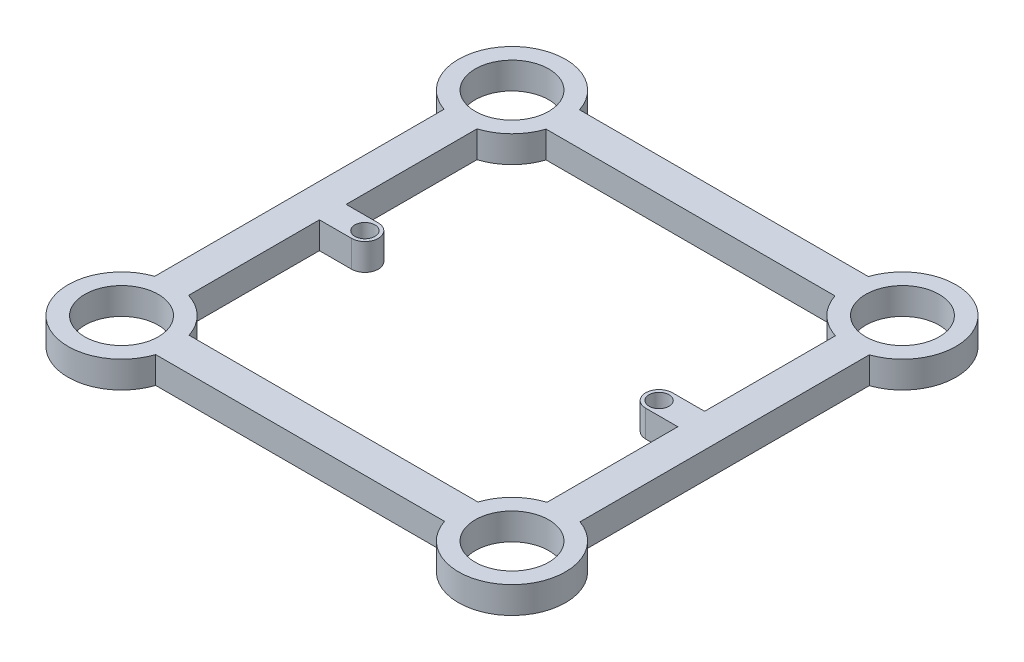
ISO-10303-21;
HEADER;
FILE_DESCRIPTION(('STEP AP214'),'2;1');
FILE_NAME('part.step','',(''),(''),'','','');
FILE_SCHEMA(('AUTOMOTIVE_DESIGN { 1 0 10303 214 1 1 1 1 }'));
ENDSEC;
DATA;
#1=APPLICATION_CONTEXT('core data for automotive mechanical design processes');
#2=APPLICATION_PROTOCOL_DEFINITION('international standard','automotive_design',2000,#1);
#3=PRODUCT_CONTEXT('',#1,'mechanical');
#4=PRODUCT('Part','Part','',(#3));
#5=PRODUCT_RELATED_PRODUCT_CATEGORY('part','',(#4));
#6=PRODUCT_DEFINITION_FORMATION('','',#4);
#7=PRODUCT_DEFINITION_CONTEXT('part definition',#1,'design');
#8=PRODUCT_DEFINITION('design','',#6,#7);
#9=PRODUCT_DEFINITION_SHAPE('','',#8);
#10=(LENGTH_UNIT() NAMED_UNIT(*) SI_UNIT(.MILLI.,.METRE.));
#11=(NAMED_UNIT(*) PLANE_ANGLE_UNIT() SI_UNIT($,.RADIAN.));
#12=(NAMED_UNIT(*) SI_UNIT($,.STERADIAN.) SOLID_ANGLE_UNIT());
#13=UNCERTAINTY_MEASURE_WITH_UNIT(LENGTH_MEASURE(1.E-05),#10,'distance_accuracy_value','');
#14=(GEOMETRIC_REPRESENTATION_CONTEXT(3) GLOBAL_UNCERTAINTY_ASSIGNED_CONTEXT((#13)) GLOBAL_UNIT_ASSIGNED_CONTEXT((#10,
#11,#12)) REPRESENTATION_CONTEXT('',''));
#15=CARTESIAN_POINT('',(0.,0.,0.));
#16=DIRECTION('',(0.,0.,1.));
#17=DIRECTION('',(1.,0.,0.));
#18=AXIS2_PLACEMENT_3D('',#15,#16,#17);
#19=CARTESIAN_POINT('',(0.,2.54,-1.26999999999998));
#20=DIRECTION('',(0.,0.,-1.));
#21=DIRECTION('',(-1.,0.,0.));
#22=AXIS2_PLACEMENT_3D('',#19,#20,#21);
#23=PLANE('',#22);
#24=DIRECTION('',(1.,0.,0.));
#25=VECTOR('',#24,1.);
#26=CARTESIAN_POINT('',(0.,0.,-1.26999999999998));
#27=LINE('',#26,#25);
#28=CARTESIAN_POINT('',(13.9696917741455,0.,-1.27));
#29=VERTEX_POINT('',#28);
#30=CARTESIAN_POINT('',(17.0202573011455,0.,-1.27));
#31=VERTEX_POINT('',#30);
#32=EDGE_CURVE('E319',#29,#31,#27,.T.);
#33=ORIENTED_EDGE('',*,*,#32,.F.);
#34=DIRECTION('',(0.,-1.,0.));
#35=VECTOR('',#34,1.);
#36=CARTESIAN_POINT('',(13.9696917741455,2.54,-1.27));
#37=LINE('',#36,#35);
#38=CARTESIAN_POINT('',(13.9696917741455,2.54,-1.27));
#39=VERTEX_POINT('',#38);
#40=EDGE_CURVE('E11',#39,#29,#37,.T.);
#41=ORIENTED_EDGE('',*,*,#40,.F.);
#42=DIRECTION('',(1.,0.,0.));
#43=VECTOR('',#42,1.);
#44=CARTESIAN_POINT('',(0.,2.54,-1.26999999999998));
#45=LINE('',#44,#43);
#46=CARTESIAN_POINT('',(17.0202573011455,2.54,-1.27));
#47=VERTEX_POINT('',#46);
#48=EDGE_CURVE('E394',#39,#47,#45,.T.);
#49=ORIENTED_EDGE('',*,*,#48,.T.);
#50=DIRECTION('',(0.,-1.,0.));
#51=VECTOR('',#50,1.);
#52=CARTESIAN_POINT('',(17.0202573011455,2.54,-1.27));
#53=LINE('',#52,#51);
#54=EDGE_CURVE('E136',#47,#31,#53,.T.);
#55=ORIENTED_EDGE('',*,*,#54,.T.);
#56=EDGE_LOOP('',(#33,#41,#49,#55));
#57=FACE_BOUND('',#56,.T.);
#58=ADVANCED_FACE('F35',(#57),#23,.T.);
#59=CARTESIAN_POINT('',(13.9696917741455,2.54,0.));
#60=DIRECTION('',(0.,-1.,0.));
#61=DIRECTION('',(0.,0.,-1.));
#62=AXIS2_PLACEMENT_3D('',#59,#60,#61);
#63=CYLINDRICAL_SURFACE('',#62,1.27);
#64=CARTESIAN_POINT('',(13.9696917741455,0.,0.));
#65=DIRECTION('',(0.,1.,0.));
#66=DIRECTION('',(0.,0.,1.));
#67=AXIS2_PLACEMENT_3D('',#64,#65,#66);
#68=CIRCLE('',#67,1.27);
#69=CARTESIAN_POINT('',(13.9696917741455,0.,1.27));
#70=VERTEX_POINT('',#69);
#71=EDGE_CURVE('E316',#29,#70,#68,.T.);
#72=ORIENTED_EDGE('',*,*,#71,.T.);
#73=DIRECTION('',(0.,-1.,0.));
#74=VECTOR('',#73,1.);
#75=CARTESIAN_POINT('',(13.9696917741455,2.54,1.27));
#76=LINE('',#75,#74);
#77=CARTESIAN_POINT('',(13.9696917741455,2.54,1.27));
#78=VERTEX_POINT('',#77);
#79=EDGE_CURVE('E45',#78,#70,#76,.T.);
#80=ORIENTED_EDGE('',*,*,#79,.F.);
#81=CARTESIAN_POINT('',(13.9696917741455,2.54,0.));
#82=DIRECTION('',(0.,1.,0.));
#83=DIRECTION('',(0.,0.,1.));
#84=AXIS2_PLACEMENT_3D('',#81,#82,#83);
#85=CIRCLE('',#84,1.27);
#86=EDGE_CURVE('E391',#39,#78,#85,.T.);
#87=ORIENTED_EDGE('',*,*,#86,.F.);
#88=ORIENTED_EDGE('',*,*,#40,.T.);
#89=EDGE_LOOP('',(#72,#80,#87,#88));
#90=FACE_BOUND('',#89,.T.);
#91=ADVANCED_FACE('F467',(#90),#63,.T.);
#92=CARTESIAN_POINT('',(0.,2.54,1.27));
#93=DIRECTION('',(0.,0.,-1.));
#94=DIRECTION('',(-1.,0.,0.));
#95=AXIS2_PLACEMENT_3D('',#92,#93,#94);
#96=PLANE('',#95);
#97=DIRECTION('',(1.,0.,0.));
#98=VECTOR('',#97,1.);
#99=CARTESIAN_POINT('',(0.,0.,1.27));
#100=LINE('',#99,#98);
#101=CARTESIAN_POINT('',(17.0202573011455,0.,1.27));
#102=VERTEX_POINT('',#101);
#103=EDGE_CURVE('E313',#70,#102,#100,.T.);
#104=ORIENTED_EDGE('',*,*,#103,.T.);
#105=DIRECTION('',(0.,-1.,0.));
#106=VECTOR('',#105,1.);
#107=CARTESIAN_POINT('',(17.0202573011455,2.54,1.27));
#108=LINE('',#107,#106);
#109=CARTESIAN_POINT('',(17.0202573011455,2.54,1.27));
#110=VERTEX_POINT('',#109);
#111=EDGE_CURVE('E253',#110,#102,#108,.T.);
#112=ORIENTED_EDGE('',*,*,#111,.F.);
#113=DIRECTION('',(1.,0.,0.));
#114=VECTOR('',#113,1.);
#115=CARTESIAN_POINT('',(0.,2.54,1.27));
#116=LINE('',#115,#114);
#117=EDGE_CURVE('E389',#78,#110,#116,.T.);
#118=ORIENTED_EDGE('',*,*,#117,.F.);
#119=ORIENTED_EDGE('',*,*,#79,.T.);
#120=EDGE_LOOP('',(#104,#112,#118,#119));
#121=FACE_BOUND('',#120,.T.);
#122=ADVANCED_FACE('F472',(#121),#96,.F.);
#123=CARTESIAN_POINT('',(17.0202573011455,2.54,0.));
#124=DIRECTION('',(-1.,0.,0.));
#125=DIRECTION('',(0.,0.,1.));
#126=AXIS2_PLACEMENT_3D('',#123,#124,#125);
#127=PLANE('',#126);
#128=DIRECTION('',(0.,0.,-1.));
#129=VECTOR('',#128,1.);
#130=CARTESIAN_POINT('',(17.0202573011455,0.,0.));
#131=LINE('',#130,#129);
#132=CARTESIAN_POINT('',(17.0202573011455,0.,13.6952795460762));
#133=VERTEX_POINT('',#132);
#134=EDGE_CURVE('E310',#133,#102,#131,.T.);
#135=ORIENTED_EDGE('',*,*,#134,.F.);
#136=DIRECTION('',(0.,-1.,0.));
#137=VECTOR('',#136,1.);
#138=CARTESIAN_POINT('',(17.0202573011455,2.54,13.6952795460762));
#139=LINE('',#138,#137);
#140=CARTESIAN_POINT('',(17.0202573011455,2.54,13.6952795460762));
#141=VERTEX_POINT('',#140);
#142=EDGE_CURVE('E251',#141,#133,#139,.T.);
#143=ORIENTED_EDGE('',*,*,#142,.F.);
#144=DIRECTION('',(0.,0.,-1.));
#145=VECTOR('',#144,1.);
#146=CARTESIAN_POINT('',(17.0202573011455,2.54,0.));
#147=LINE('',#146,#145);
#148=EDGE_CURVE('E386',#141,#110,#147,.T.);
#149=ORIENTED_EDGE('',*,*,#148,.T.);
#150=ORIENTED_EDGE('',*,*,#111,.T.);
#151=EDGE_LOOP('',(#135,#143,#149,#150));
#152=FACE_BOUND('',#151,.T.);
#153=ADVANCED_FACE('F475',(#152),#127,.T.);
#154=CARTESIAN_POINT('',(18.542,2.54,18.542));
#155=DIRECTION('',(0.,-1.,0.));
#156=DIRECTION('',(0.,0.,-1.));
#157=AXIS2_PLACEMENT_3D('',#154,#155,#156);
#158=CYLINDRICAL_SURFACE('',#157,5.08);
#159=CARTESIAN_POINT('',(18.542,0.,18.542));
#160=DIRECTION('',(0.,1.,0.));
#161=DIRECTION('',(0.,0.,1.));
#162=AXIS2_PLACEMENT_3D('',#159,#160,#161);
#163=CIRCLE('',#162,5.08);
#164=CARTESIAN_POINT('',(13.7164177812413,0.,16.9545));
#165=VERTEX_POINT('',#164);
#166=EDGE_CURVE('E307',#165,#133,#163,.F.);
#167=ORIENTED_EDGE('',*,*,#166,.F.);
#168=DIRECTION('',(0.,-1.,0.));
#169=VECTOR('',#168,1.);
#170=CARTESIAN_POINT('',(13.7164177812413,2.54,16.9545));
#171=LINE('',#170,#169);
#172=CARTESIAN_POINT('',(13.7164177812413,2.54,16.9545));
#173=VERTEX_POINT('',#172);
#174=EDGE_CURVE('E249',#173,#165,#171,.T.);
#175=ORIENTED_EDGE('',*,*,#174,.F.);
#176=CARTESIAN_POINT('',(18.542,2.54,18.542));
#177=DIRECTION('',(0.,1.,0.));
#178=DIRECTION('',(0.,0.,1.));
#179=AXIS2_PLACEMENT_3D('',#176,#177,#178);
#180=CIRCLE('',#179,5.08);
#181=EDGE_CURVE('E383',#173,#141,#180,.F.);
#182=ORIENTED_EDGE('',*,*,#181,.T.);
#183=ORIENTED_EDGE('',*,*,#142,.T.);
#184=EDGE_LOOP('',(#167,#175,#182,#183));
#185=FACE_BOUND('',#184,.T.);
#186=ADVANCED_FACE('F478',(#185),#158,.T.);
#187=CARTESIAN_POINT('',(0.,2.54,16.9545));
#188=DIRECTION('',(0.,0.,-1.));
#189=DIRECTION('',(-1.,0.,0.));
#190=AXIS2_PLACEMENT_3D('',#187,#188,#189);
#191=PLANE('',#190);
#192=DIRECTION('',(1.,0.,0.));
#193=VECTOR('',#192,1.);
#194=CARTESIAN_POINT('',(0.,0.,16.9545));
#195=LINE('',#194,#193);
#196=CARTESIAN_POINT('',(-13.7164177812413,0.,16.9545));
#197=VERTEX_POINT('',#196);
#198=EDGE_CURVE('E304',#197,#165,#195,.T.);
#199=ORIENTED_EDGE('',*,*,#198,.F.);
#200=DIRECTION('',(0.,-1.,0.));
#201=VECTOR('',#200,1.);
#202=CARTESIAN_POINT('',(-13.7164177812413,2.54,16.9545));
#203=LINE('',#202,#201);
#204=CARTESIAN_POINT('',(-13.7164177812413,2.54,16.9545));
#205=VERTEX_POINT('',#204);
#206=EDGE_CURVE('E247',#205,#197,#203,.T.);
#207=ORIENTED_EDGE('',*,*,#206,.F.);
#208=DIRECTION('',(1.,0.,0.));
#209=VECTOR('',#208,1.);
#210=CARTESIAN_POINT('',(0.,2.54,16.9545));
#211=LINE('',#210,#209);
#212=EDGE_CURVE('E380',#205,#173,#211,.T.);
#213=ORIENTED_EDGE('',*,*,#212,.T.);
#214=ORIENTED_EDGE('',*,*,#174,.T.);
#215=EDGE_LOOP('',(#199,#207,#213,#214));
#216=FACE_BOUND('',#215,.T.);
#217=ADVANCED_FACE('F483',(#216),#191,.T.);
#218=CARTESIAN_POINT('',(-18.542,2.54,18.542));
#219=DIRECTION('',(0.,-1.,0.));
#220=DIRECTION('',(0.,0.,-1.));
#221=AXIS2_PLACEMENT_3D('',#218,#219,#220);
#222=CYLINDRICAL_SURFACE('',#221,5.08);
#223=CARTESIAN_POINT('',(-18.542,0.,18.542));
#224=DIRECTION('',(0.,1.,0.));
#225=DIRECTION('',(0.,0.,1.));
#226=AXIS2_PLACEMENT_3D('',#223,#224,#225);
#227=CIRCLE('',#226,5.08);
#228=CARTESIAN_POINT('',(-17.0202573011455,0.,13.6952795460762));
#229=VERTEX_POINT('',#228);
#230=EDGE_CURVE('E301',#229,#197,#227,.F.);
#231=ORIENTED_EDGE('',*,*,#230,.F.);
#232=DIRECTION('',(0.,-1.,0.));
#233=VECTOR('',#232,1.);
#234=CARTESIAN_POINT('',(-17.0202573011455,2.54,13.6952795460762));
#235=LINE('',#234,#233);
#236=CARTESIAN_POINT('',(-17.0202573011455,2.54,13.6952795460762));
#237=VERTEX_POINT('',#236);
#238=EDGE_CURVE('E245',#237,#229,#235,.T.);
#239=ORIENTED_EDGE('',*,*,#238,.F.);
#240=CARTESIAN_POINT('',(-18.542,2.54,18.542));
#241=DIRECTION('',(0.,1.,0.));
#242=DIRECTION('',(0.,0.,1.));
#243=AXIS2_PLACEMENT_3D('',#240,#241,#242);
#244=CIRCLE('',#243,5.08);
#245=EDGE_CURVE('E377',#237,#205,#244,.F.);
#246=ORIENTED_EDGE('',*,*,#245,.T.);
#247=ORIENTED_EDGE('',*,*,#206,.T.);
#248=EDGE_LOOP('',(#231,#239,#246,#247));
#249=FACE_BOUND('',#248,.T.);
#250=ADVANCED_FACE('F486',(#249),#222,.T.);
#251=CARTESIAN_POINT('',(-17.0202573011455,2.54,0.));
#252=DIRECTION('',(-1.,0.,0.));
#253=DIRECTION('',(0.,0.,1.));
#254=AXIS2_PLACEMENT_3D('',#251,#252,#253);
#255=PLANE('',#254);
#256=DIRECTION('',(0.,0.,-1.));
#257=VECTOR('',#256,1.);
#258=CARTESIAN_POINT('',(-17.0202573011455,0.,0.));
#259=LINE('',#258,#257);
#260=CARTESIAN_POINT('',(-17.0202573011455,0.,1.27));
#261=VERTEX_POINT('',#260);
#262=EDGE_CURVE('E298',#229,#261,#259,.T.);
#263=ORIENTED_EDGE('',*,*,#262,.T.);
#264=DIRECTION('',(0.,-1.,0.));
#265=VECTOR('',#264,1.);
#266=CARTESIAN_POINT('',(-17.0202573011455,2.54,1.27));
#267=LINE('',#266,#265);
#268=CARTESIAN_POINT('',(-17.0202573011455,2.54,1.27));
#269=VERTEX_POINT('',#268);
#270=EDGE_CURVE('E243',#269,#261,#267,.T.);
#271=ORIENTED_EDGE('',*,*,#270,.F.);
#272=DIRECTION('',(0.,0.,-1.));
#273=VECTOR('',#272,1.);
#274=CARTESIAN_POINT('',(-17.0202573011455,2.54,0.));
#275=LINE('',#274,#273);
#276=EDGE_CURVE('E375',#237,#269,#275,.T.);
#277=ORIENTED_EDGE('',*,*,#276,.F.);
#278=ORIENTED_EDGE('',*,*,#238,.T.);
#279=EDGE_LOOP('',(#263,#271,#277,#278));
#280=FACE_BOUND('',#279,.T.);
#281=ADVANCED_FACE('F491',(#280),#255,.F.);
#282=CARTESIAN_POINT('',(0.,2.54,1.27));
#283=DIRECTION('',(0.,0.,1.));
#284=DIRECTION('',(1.,0.,0.));
#285=AXIS2_PLACEMENT_3D('',#282,#283,#284);
#286=PLANE('',#285);
#287=DIRECTION('',(-1.,0.,0.));
#288=VECTOR('',#287,1.);
#289=CARTESIAN_POINT('',(0.,0.,1.27));
#290=LINE('',#289,#288);
#291=CARTESIAN_POINT('',(-13.9696917741455,0.,1.27));
#292=VERTEX_POINT('',#291);
#293=EDGE_CURVE('E295',#292,#261,#290,.T.);
#294=ORIENTED_EDGE('',*,*,#293,.F.);
#295=DIRECTION('',(0.,-1.,0.));
#296=VECTOR('',#295,1.);
#297=CARTESIAN_POINT('',(-13.9696917741455,2.54,1.27));
#298=LINE('',#297,#296);
#299=CARTESIAN_POINT('',(-13.9696917741455,2.54,1.27));
#300=VERTEX_POINT('',#299);
#301=EDGE_CURVE('E241',#300,#292,#298,.T.);
#302=ORIENTED_EDGE('',*,*,#301,.F.);
#303=DIRECTION('',(-1.,0.,0.));
#304=VECTOR('',#303,1.);
#305=CARTESIAN_POINT('',(0.,2.54,1.27));
#306=LINE('',#305,#304);
#307=EDGE_CURVE('E372',#300,#269,#306,.T.);
#308=ORIENTED_EDGE('',*,*,#307,.T.);
#309=ORIENTED_EDGE('',*,*,#270,.T.);
#310=EDGE_LOOP('',(#294,#302,#308,#309));
#311=FACE_BOUND('',#310,.T.);
#312=ADVANCED_FACE('F495',(#311),#286,.T.);
#313=CARTESIAN_POINT('',(-13.9696917741455,2.54,0.));
#314=DIRECTION('',(0.,-1.,0.));
#315=DIRECTION('',(0.,0.,-1.));
#316=AXIS2_PLACEMENT_3D('',#313,#314,#315);
#317=CYLINDRICAL_SURFACE('',#316,1.27);
#318=CARTESIAN_POINT('',(-13.9696917741455,0.,0.));
#319=DIRECTION('',(0.,1.,0.));
#320=DIRECTION('',(0.,0.,1.));
#321=AXIS2_PLACEMENT_3D('',#318,#319,#320);
#322=CIRCLE('',#321,1.27);
#323=CARTESIAN_POINT('',(-13.9696917741455,0.,-1.26999999999999));
#324=VERTEX_POINT('',#323);
#325=EDGE_CURVE('E292',#292,#324,#322,.T.);
#326=ORIENTED_EDGE('',*,*,#325,.T.);
#327=DIRECTION('',(0.,-1.,0.));
#328=VECTOR('',#327,1.);
#329=CARTESIAN_POINT('',(-13.9696917741455,2.54,-1.26999999999999));
#330=LINE('',#329,#328);
#331=CARTESIAN_POINT('',(-13.9696917741455,2.54,-1.26999999999999));
#332=VERTEX_POINT('',#331);
#333=EDGE_CURVE('E238',#332,#324,#330,.T.);
#334=ORIENTED_EDGE('',*,*,#333,.F.);
#335=CARTESIAN_POINT('',(-13.9696917741455,2.54,0.));
#336=DIRECTION('',(0.,1.,0.));
#337=DIRECTION('',(0.,0.,1.));
#338=AXIS2_PLACEMENT_3D('',#335,#336,#337);
#339=CIRCLE('',#338,1.27);
#340=EDGE_CURVE('E369',#300,#332,#339,.T.);
#341=ORIENTED_EDGE('',*,*,#340,.F.);
#342=ORIENTED_EDGE('',*,*,#301,.T.);
#343=EDGE_LOOP('',(#326,#334,#341,#342));
#344=FACE_BOUND('',#343,.T.);
#345=ADVANCED_FACE('F500',(#344),#317,.T.);
#346=CARTESIAN_POINT('',(0.,2.54,-1.26999999999997));
#347=DIRECTION('',(0.,0.,1.));
#348=DIRECTION('',(1.,0.,0.));
#349=AXIS2_PLACEMENT_3D('',#346,#347,#348);
#350=PLANE('',#349);
#351=DIRECTION('',(-1.,0.,0.));
#352=VECTOR('',#351,1.);
#353=CARTESIAN_POINT('',(0.,0.,-1.26999999999997));
#354=LINE('',#353,#352);
#355=CARTESIAN_POINT('',(-17.0202573011455,0.,-1.27));
#356=VERTEX_POINT('',#355);
#357=EDGE_CURVE('E289',#324,#356,#354,.T.);
#358=ORIENTED_EDGE('',*,*,#357,.T.);
#359=DIRECTION('',(0.,-1.,0.));
#360=VECTOR('',#359,1.);
#361=CARTESIAN_POINT('',(-17.0202573011455,2.54,-1.27));
#362=LINE('',#361,#360);
#363=CARTESIAN_POINT('',(-17.0202573011455,2.54,-1.27));
#364=VERTEX_POINT('',#363);
#365=EDGE_CURVE('E236',#364,#356,#362,.T.);
#366=ORIENTED_EDGE('',*,*,#365,.F.);
#367=DIRECTION('',(-1.,0.,0.));
#368=VECTOR('',#367,1.);
#369=CARTESIAN_POINT('',(0.,2.54,-1.26999999999997));
#370=LINE('',#369,#368);
#371=EDGE_CURVE('E367',#332,#364,#370,.T.);
#372=ORIENTED_EDGE('',*,*,#371,.F.);
#373=ORIENTED_EDGE('',*,*,#333,.T.);
#374=EDGE_LOOP('',(#358,#366,#372,#373));
#375=FACE_BOUND('',#374,.T.);
#376=ADVANCED_FACE('F503',(#375),#350,.F.);
#377=CARTESIAN_POINT('',(-17.0202573011455,2.54,0.));
#378=DIRECTION('',(1.,0.,0.));
#379=DIRECTION('',(0.,0.,-1.));
#380=AXIS2_PLACEMENT_3D('',#377,#378,#379);
#381=PLANE('',#380);
#382=DIRECTION('',(0.,0.,1.));
#383=VECTOR('',#382,1.);
#384=CARTESIAN_POINT('',(-17.0202573011455,0.,0.));
#385=LINE('',#384,#383);
#386=CARTESIAN_POINT('',(-17.0202573011455,0.,-13.6952795460762));
#387=VERTEX_POINT('',#386);
#388=EDGE_CURVE('E286',#387,#356,#385,.T.);
#389=ORIENTED_EDGE('',*,*,#388,.F.);
#390=DIRECTION('',(0.,-1.,0.));
#391=VECTOR('',#390,1.);
#392=CARTESIAN_POINT('',(-17.0202573011455,2.54,-13.6952795460762));
#393=LINE('',#392,#391);
#394=CARTESIAN_POINT('',(-17.0202573011455,2.54,-13.6952795460762));
#395=VERTEX_POINT('',#394);
#396=EDGE_CURVE('E230',#395,#387,#393,.T.);
#397=ORIENTED_EDGE('',*,*,#396,.F.);
#398=DIRECTION('',(0.,0.,1.));
#399=VECTOR('',#398,1.);
#400=CARTESIAN_POINT('',(-17.0202573011455,2.54,0.));
#401=LINE('',#400,#399);
#402=EDGE_CURVE('E364',#395,#364,#401,.T.);
#403=ORIENTED_EDGE('',*,*,#402,.T.);
#404=ORIENTED_EDGE('',*,*,#365,.T.);
#405=EDGE_LOOP('',(#389,#397,#403,#404));
#406=FACE_BOUND('',#405,.T.);
#407=ADVANCED_FACE('F506',(#406),#381,.T.);
#408=CARTESIAN_POINT('',(-18.542,2.54,-18.542));
#409=DIRECTION('',(0.,-1.,0.));
#410=DIRECTION('',(0.,0.,-1.));
#411=AXIS2_PLACEMENT_3D('',#408,#409,#410);
#412=CYLINDRICAL_SURFACE('',#411,5.08);
#413=CARTESIAN_POINT('',(-18.542,0.,-18.542));
#414=DIRECTION('',(0.,1.,0.));
#415=DIRECTION('',(0.,0.,1.));
#416=AXIS2_PLACEMENT_3D('',#413,#414,#415);
#417=CIRCLE('',#416,5.08);
#418=CARTESIAN_POINT('',(-13.7164177812413,0.,-16.9545));
#419=VERTEX_POINT('',#418);
#420=EDGE_CURVE('E283',#387,#419,#417,.T.);
#421=ORIENTED_EDGE('',*,*,#420,.T.);
#422=DIRECTION('',(0.,-1.,0.));
#423=VECTOR('',#422,1.);
#424=CARTESIAN_POINT('',(-13.7164177812413,2.54,-16.9545));
#425=LINE('',#424,#423);
#426=CARTESIAN_POINT('',(-13.7164177812413,2.54,-16.9545));
#427=VERTEX_POINT('',#426);
#428=EDGE_CURVE('E228',#427,#419,#425,.T.);
#429=ORIENTED_EDGE('',*,*,#428,.F.);
#430=CARTESIAN_POINT('',(-18.542,2.54,-18.542));
#431=DIRECTION('',(0.,1.,0.));
#432=DIRECTION('',(0.,0.,1.));
#433=AXIS2_PLACEMENT_3D('',#430,#431,#432);
#434=CIRCLE('',#433,5.08);
#435=EDGE_CURVE('E221',#395,#427,#434,.T.);
#436=ORIENTED_EDGE('',*,*,#435,.F.);
#437=ORIENTED_EDGE('',*,*,#396,.T.);
#438=EDGE_LOOP('',(#421,#429,#436,#437));
#439=FACE_BOUND('',#438,.T.);
#440=ADVANCED_FACE('F509',(#439),#412,.T.);
#441=CARTESIAN_POINT('',(0.,2.54,-16.9545));
#442=DIRECTION('',(0.,0.,-1.));
#443=DIRECTION('',(-1.,0.,0.));
#444=AXIS2_PLACEMENT_3D('',#441,#442,#443);
#445=PLANE('',#444);
#446=DIRECTION('',(1.,0.,0.));
#447=VECTOR('',#446,1.);
#448=CARTESIAN_POINT('',(0.,0.,-16.9545));
#449=LINE('',#448,#447);
#450=CARTESIAN_POINT('',(13.7164177812413,0.,-16.9545));
#451=VERTEX_POINT('',#450);
#452=EDGE_CURVE('E227',#419,#451,#449,.T.);
#453=ORIENTED_EDGE('',*,*,#452,.T.);
#454=DIRECTION('',(0.,-1.,0.));
#455=VECTOR('',#454,1.);
#456=CARTESIAN_POINT('',(13.7164177812413,2.54,-16.9545));
#457=LINE('',#456,#455);
#458=CARTESIAN_POINT('',(13.7164177812413,2.54,-16.9545));
#459=VERTEX_POINT('',#458);
#460=EDGE_CURVE('E212',#459,#451,#457,.T.);
#461=ORIENTED_EDGE('',*,*,#460,.F.);
#462=DIRECTION('',(1.,0.,0.));
#463=VECTOR('',#462,1.);
#464=CARTESIAN_POINT('',(0.,2.54,-16.9545));
#465=LINE('',#464,#463);
#466=EDGE_CURVE('E215',#427,#459,#465,.T.);
#467=ORIENTED_EDGE('',*,*,#466,.F.);
#468=ORIENTED_EDGE('',*,*,#428,.T.);
#469=EDGE_LOOP('',(#453,#461,#467,#468));
#470=FACE_BOUND('',#469,.T.);
#471=ADVANCED_FACE('F226',(#470),#445,.F.);
#472=CARTESIAN_POINT('',(18.542,2.54,-18.542));
#473=DIRECTION('',(0.,-1.,0.));
#474=DIRECTION('',(0.,0.,-1.));
#475=AXIS2_PLACEMENT_3D('',#472,#473,#474);
#476=CYLINDRICAL_SURFACE('',#475,5.08);
#477=CARTESIAN_POINT('',(18.542,0.,-18.542));
#478=DIRECTION('',(0.,1.,0.));
#479=DIRECTION('',(0.,0.,1.));
#480=AXIS2_PLACEMENT_3D('',#477,#478,#479);
#481=CIRCLE('',#480,5.08);
#482=CARTESIAN_POINT('',(17.0202573011455,0.,-13.6952795460762));
#483=VERTEX_POINT('',#482);
#484=EDGE_CURVE('E280',#451,#483,#481,.T.);
#485=ORIENTED_EDGE('',*,*,#484,.T.);
#486=DIRECTION('',(0.,-1.,0.));
#487=VECTOR('',#486,1.);
#488=CARTESIAN_POINT('',(17.0202573011455,2.54,-13.6952795460762));
#489=LINE('',#488,#487);
#490=CARTESIAN_POINT('',(17.0202573011455,2.54,-13.6952795460762));
#491=VERTEX_POINT('',#490);
#492=EDGE_CURVE('E214',#491,#483,#489,.T.);
#493=ORIENTED_EDGE('',*,*,#492,.F.);
#494=CARTESIAN_POINT('',(18.542,2.54,-18.542));
#495=DIRECTION('',(0.,1.,0.));
#496=DIRECTION('',(0.,0.,1.));
#497=AXIS2_PLACEMENT_3D('',#494,#495,#496);
#498=CIRCLE('',#497,5.08);
#499=EDGE_CURVE('E207',#459,#491,#498,.T.);
#500=ORIENTED_EDGE('',*,*,#499,.F.);
#501=ORIENTED_EDGE('',*,*,#460,.T.);
#502=EDGE_LOOP('',(#485,#493,#500,#501));
#503=FACE_BOUND('',#502,.T.);
#504=ADVANCED_FACE('F210',(#503),#476,.T.);
#505=CARTESIAN_POINT('',(18.542,2.54,18.542));
#506=DIRECTION('',(0.,-1.,0.));
#507=DIRECTION('',(0.,0.,-1.));
#508=AXIS2_PLACEMENT_3D('',#505,#506,#507);
#509=CYLINDRICAL_SURFACE('',#508,5.08);
#510=CARTESIAN_POINT('',(18.542,0.,18.542));
#511=DIRECTION('',(0.,1.,0.));
#512=DIRECTION('',(0.,0.,1.));
#513=AXIS2_PLACEMENT_3D('',#510,#511,#512);
#514=CIRCLE('',#513,5.08);
#515=CARTESIAN_POINT('',(20.1952573011455,0.,13.7385491262833));
#516=VERTEX_POINT('',#515);
#517=CARTESIAN_POINT('',(13.7164177812413,0.,20.1295));
#518=VERTEX_POINT('',#517);
#519=EDGE_CURVE('E353',#516,#518,#514,.F.);
#520=ORIENTED_EDGE('',*,*,#519,.F.);
#521=DIRECTION('',(0.,-1.,0.));
#522=VECTOR('',#521,1.);
#523=CARTESIAN_POINT('',(20.1952573011455,2.54,13.7385491262833));
#524=LINE('',#523,#522);
#525=CARTESIAN_POINT('',(20.1952573011455,2.54,13.7385491262833));
#526=VERTEX_POINT('',#525);
#527=EDGE_CURVE('E39',#526,#516,#524,.T.);
#528=ORIENTED_EDGE('',*,*,#527,.F.);
#529=CARTESIAN_POINT('',(18.542,2.54,18.542));
#530=DIRECTION('',(0.,1.,0.));
#531=DIRECTION('',(0.,0.,1.));
#532=AXIS2_PLACEMENT_3D('',#529,#530,#531);
#533=CIRCLE('',#532,5.08);
#534=CARTESIAN_POINT('',(13.7164177812413,2.54,20.1295));
#535=VERTEX_POINT('',#534);
#536=EDGE_CURVE('E425',#526,#535,#533,.F.);
#537=ORIENTED_EDGE('',*,*,#536,.T.);
#538=DIRECTION('',(0.,-1.,0.));
#539=VECTOR('',#538,1.);
#540=CARTESIAN_POINT('',(13.7164177812413,2.54,20.1295));
#541=LINE('',#540,#539);
#542=EDGE_CURVE('E257',#535,#518,#541,.T.);
#543=ORIENTED_EDGE('',*,*,#542,.T.);
#544=EDGE_LOOP('',(#520,#528,#537,#543));
#545=FACE_BOUND('',#544,.T.);
#546=ADVANCED_FACE('F563',(#545),#509,.T.);
#547=CARTESIAN_POINT('',(20.1952573011455,2.54,0.));
#548=DIRECTION('',(1.,0.,0.));
#549=DIRECTION('',(0.,0.,-1.));
#550=AXIS2_PLACEMENT_3D('',#547,#548,#549);
#551=PLANE('',#550);
#552=DIRECTION('',(0.,0.,1.));
#553=VECTOR('',#552,1.);
#554=CARTESIAN_POINT('',(20.1952573011455,0.,0.));
#555=LINE('',#554,#553);
#556=CARTESIAN_POINT('',(20.1952573011455,0.,-13.7385491262833));
#557=VERTEX_POINT('',#556);
#558=EDGE_CURVE('E350',#557,#516,#555,.T.);
#559=ORIENTED_EDGE('',*,*,#558,.F.);
#560=DIRECTION('',(0.,-1.,0.));
#561=VECTOR('',#560,1.);
#562=CARTESIAN_POINT('',(20.1952573011455,2.54,-13.7385491262833));
#563=LINE('',#562,#561);
#564=CARTESIAN_POINT('',(20.1952573011455,2.54,-13.7385491262833));
#565=VERTEX_POINT('',#564);
#566=EDGE_CURVE('E269',#565,#557,#563,.T.);
#567=ORIENTED_EDGE('',*,*,#566,.F.);
#568=DIRECTION('',(0.,0.,1.));
#569=VECTOR('',#568,1.);
#570=CARTESIAN_POINT('',(20.1952573011455,2.54,0.));
#571=LINE('',#570,#569);
#572=EDGE_CURVE('E423',#565,#526,#571,.T.);
#573=ORIENTED_EDGE('',*,*,#572,.T.);
#574=ORIENTED_EDGE('',*,*,#527,.T.);
#575=EDGE_LOOP('',(#559,#567,#573,#574));
#576=FACE_BOUND('',#575,.T.);
#577=ADVANCED_FACE('F560',(#576),#551,.T.);
#578=CARTESIAN_POINT('',(18.542,2.54,-18.542));
#579=DIRECTION('',(0.,-1.,0.));
#580=DIRECTION('',(0.,0.,-1.));
#581=AXIS2_PLACEMENT_3D('',#578,#579,#580);
#582=CYLINDRICAL_SURFACE('',#581,5.08);
#583=CARTESIAN_POINT('',(18.542,0.,-18.542));
#584=DIRECTION('',(0.,1.,0.));
#585=DIRECTION('',(0.,0.,1.));
#586=AXIS2_PLACEMENT_3D('',#583,#584,#585);
#587=CIRCLE('',#586,5.08);
#588=CARTESIAN_POINT('',(13.7164177812413,0.,-20.1295));
#589=VERTEX_POINT('',#588);
#590=EDGE_CURVE('E348',#557,#589,#587,.T.);
#591=ORIENTED_EDGE('',*,*,#590,.T.);
#592=DIRECTION('',(0.,-1.,0.));
#593=VECTOR('',#592,1.);
#594=CARTESIAN_POINT('',(13.7164177812413,2.54,-20.1295));
#595=LINE('',#594,#593);
#596=CARTESIAN_POINT('',(13.7164177812413,2.54,-20.1295));
#597=VERTEX_POINT('',#596);
#598=EDGE_CURVE('E268',#597,#589,#595,.T.);
#599=ORIENTED_EDGE('',*,*,#598,.F.);
#600=CARTESIAN_POINT('',(18.542,2.54,-18.542));
#601=DIRECTION('',(0.,1.,0.));
#602=DIRECTION('',(0.,0.,1.));
#603=AXIS2_PLACEMENT_3D('',#600,#601,#602);
#604=CIRCLE('',#603,5.08);
#605=EDGE_CURVE('E421',#565,#597,#604,.T.);
#606=ORIENTED_EDGE('',*,*,#605,.F.);
#607=ORIENTED_EDGE('',*,*,#566,.T.);
#608=EDGE_LOOP('',(#591,#599,#606,#607));
#609=FACE_BOUND('',#608,.T.);
#610=ADVANCED_FACE('F556',(#609),#582,.T.);
#611=CARTESIAN_POINT('',(0.,2.54,-20.1295));
#612=DIRECTION('',(0.,0.,-1.));
#613=DIRECTION('',(-1.,0.,0.));
#614=AXIS2_PLACEMENT_3D('',#611,#612,#613);
#615=PLANE('',#614);
#616=DIRECTION('',(1.,0.,0.));
#617=VECTOR('',#616,1.);
#618=CARTESIAN_POINT('',(0.,0.,-20.1295));
#619=LINE('',#618,#617);
#620=CARTESIAN_POINT('',(-13.7164177812413,0.,-20.1295));
#621=VERTEX_POINT('',#620);
#622=EDGE_CURVE('E345',#621,#589,#619,.T.);
#623=ORIENTED_EDGE('',*,*,#622,.F.);
#624=DIRECTION('',(0.,-1.,0.));
#625=VECTOR('',#624,1.);
#626=CARTESIAN_POINT('',(-13.7164177812413,2.54,-20.1295));
#627=LINE('',#626,#625);
#628=CARTESIAN_POINT('',(-13.7164177812413,2.54,-20.1295));
#629=VERTEX_POINT('',#628);
#630=EDGE_CURVE('E266',#629,#621,#627,.T.);
#631=ORIENTED_EDGE('',*,*,#630,.F.);
#632=DIRECTION('',(1.,0.,0.));
#633=VECTOR('',#632,1.);
#634=CARTESIAN_POINT('',(0.,2.54,-20.1295));
#635=LINE('',#634,#633);
#636=EDGE_CURVE('E418',#629,#597,#635,.T.);
#637=ORIENTED_EDGE('',*,*,#636,.T.);
#638=ORIENTED_EDGE('',*,*,#598,.T.);
#639=EDGE_LOOP('',(#623,#631,#637,#638));
#640=FACE_BOUND('',#639,.T.);
#641=ADVANCED_FACE('F552',(#640),#615,.T.);
#642=CARTESIAN_POINT('',(-18.542,2.54,-18.542));
#643=DIRECTION('',(0.,-1.,0.));
#644=DIRECTION('',(0.,0.,-1.));
#645=AXIS2_PLACEMENT_3D('',#642,#643,#644);
#646=CYLINDRICAL_SURFACE('',#645,5.08);
#647=CARTESIAN_POINT('',(-18.542,0.,-18.542));
#648=DIRECTION('',(0.,1.,0.));
#649=DIRECTION('',(0.,0.,1.));
#650=AXIS2_PLACEMENT_3D('',#647,#648,#649);
#651=CIRCLE('',#650,5.08);
#652=CARTESIAN_POINT('',(-20.1952573011455,0.,-13.7385491262833));
#653=VERTEX_POINT('',#652);
#654=EDGE_CURVE('E342',#621,#653,#651,.T.);
#655=ORIENTED_EDGE('',*,*,#654,.T.);
#656=DIRECTION('',(0.,-1.,0.));
#657=VECTOR('',#656,1.);
#658=CARTESIAN_POINT('',(-20.1952573011455,2.54,-13.7385491262833));
#659=LINE('',#658,#657);
#660=CARTESIAN_POINT('',(-20.1952573011455,2.54,-13.7385491262833));
#661=VERTEX_POINT('',#660);
#662=EDGE_CURVE('E263',#661,#653,#659,.T.);
#663=ORIENTED_EDGE('',*,*,#662,.F.);
#664=CARTESIAN_POINT('',(-18.542,2.54,-18.542));
#665=DIRECTION('',(0.,1.,0.));
#666=DIRECTION('',(0.,0.,1.));
#667=AXIS2_PLACEMENT_3D('',#664,#665,#666);
#668=CIRCLE('',#667,5.08);
#669=EDGE_CURVE('E415',#629,#661,#668,.T.);
#670=ORIENTED_EDGE('',*,*,#669,.F.);
#671=ORIENTED_EDGE('',*,*,#630,.T.);
#672=EDGE_LOOP('',(#655,#663,#670,#671));
#673=FACE_BOUND('',#672,.T.);
#674=ADVANCED_FACE('F548',(#673),#646,.T.);
#675=CARTESIAN_POINT('',(-20.1952573011455,2.54,0.));
#676=DIRECTION('',(1.,0.,0.));
#677=DIRECTION('',(0.,0.,-1.));
#678=AXIS2_PLACEMENT_3D('',#675,#676,#677);
#679=PLANE('',#678);
#680=DIRECTION('',(0.,0.,1.));
#681=VECTOR('',#680,1.);
#682=CARTESIAN_POINT('',(-20.1952573011455,0.,0.));
#683=LINE('',#682,#681);
#684=CARTESIAN_POINT('',(-20.1952573011455,0.,13.7385491262833));
#685=VERTEX_POINT('',#684);
#686=EDGE_CURVE('E339',#653,#685,#683,.T.);
#687=ORIENTED_EDGE('',*,*,#686,.T.);
#688=DIRECTION('',(0.,-1.,0.));
#689=VECTOR('',#688,1.);
#690=CARTESIAN_POINT('',(-20.1952573011455,2.54,13.7385491262833));
#691=LINE('',#690,#689);
#692=CARTESIAN_POINT('',(-20.1952573011455,2.54,13.7385491262833));
#693=VERTEX_POINT('',#692);
#694=EDGE_CURVE('E261',#693,#685,#691,.T.);
#695=ORIENTED_EDGE('',*,*,#694,.F.);
#696=DIRECTION('',(0.,0.,1.));
#697=VECTOR('',#696,1.);
#698=CARTESIAN_POINT('',(-20.1952573011455,2.54,0.));
#699=LINE('',#698,#697);
#700=EDGE_CURVE('E413',#661,#693,#699,.T.);
#701=ORIENTED_EDGE('',*,*,#700,.F.);
#702=ORIENTED_EDGE('',*,*,#662,.T.);
#703=EDGE_LOOP('',(#687,#695,#701,#702));
#704=FACE_BOUND('',#703,.T.);
#705=ADVANCED_FACE('F544',(#704),#679,.F.);
#706=CARTESIAN_POINT('',(-18.542,2.54,18.542));
#707=DIRECTION('',(0.,-1.,0.));
#708=DIRECTION('',(0.,0.,-1.));
#709=AXIS2_PLACEMENT_3D('',#706,#707,#708);
#710=CYLINDRICAL_SURFACE('',#709,5.08);
#711=CARTESIAN_POINT('',(-18.542,0.,18.542));
#712=DIRECTION('',(0.,1.,0.));
#713=DIRECTION('',(0.,0.,1.));
#714=AXIS2_PLACEMENT_3D('',#711,#712,#713);
#715=CIRCLE('',#714,5.08);
#716=CARTESIAN_POINT('',(-13.7164177812413,0.,20.1295));
#717=VERTEX_POINT('',#716);
#718=EDGE_CURVE('E336',#717,#685,#715,.F.);
#719=ORIENTED_EDGE('',*,*,#718,.F.);
#720=DIRECTION('',(0.,-1.,0.));
#721=VECTOR('',#720,1.);
#722=CARTESIAN_POINT('',(-13.7164177812413,2.54,20.1295));
#723=LINE('',#722,#721);
#724=CARTESIAN_POINT('',(-13.7164177812413,2.54,20.1295));
#725=VERTEX_POINT('',#724);
#726=EDGE_CURVE('E259',#725,#717,#723,.T.);
#727=ORIENTED_EDGE('',*,*,#726,.F.);
#728=CARTESIAN_POINT('',(-18.542,2.54,18.542));
#729=DIRECTION('',(0.,1.,0.));
#730=DIRECTION('',(0.,0.,1.));
#731=AXIS2_PLACEMENT_3D('',#728,#729,#730);
#732=CIRCLE('',#731,5.08);
#733=EDGE_CURVE('E410',#725,#693,#732,.F.);
#734=ORIENTED_EDGE('',*,*,#733,.T.);
#735=ORIENTED_EDGE('',*,*,#694,.T.);
#736=EDGE_LOOP('',(#719,#727,#734,#735));
#737=FACE_BOUND('',#736,.T.);
#738=ADVANCED_FACE('F456',(#737),#710,.T.);
#739=CARTESIAN_POINT('',(-18.542,2.54,18.542));
#740=DIRECTION('',(0.,-1.,0.));
#741=DIRECTION('',(0.,0.,-1.));
#742=AXIS2_PLACEMENT_3D('',#739,#740,#741);
#743=CYLINDRICAL_SURFACE('',#742,3.4925);
#744=CARTESIAN_POINT('',(-18.542,2.54,18.542));
#745=DIRECTION('',(0.,1.,0.));
#746=DIRECTION('',(0.,0.,1.));
#747=AXIS2_PLACEMENT_3D('',#744,#745,#746);
#748=CIRCLE('',#747,3.4925);
#749=CARTESIAN_POINT('',(-18.542,2.54,22.0345));
#750=VERTEX_POINT('',#749);
#751=EDGE_CURVE('E396',#750,#750,#748,.F.);
#752=ORIENTED_EDGE('',*,*,#751,.F.);
#753=EDGE_LOOP('',(#752));
#754=FACE_BOUND('',#753,.T.);
#755=CARTESIAN_POINT('',(-18.542,0.,18.542));
#756=DIRECTION('',(0.,1.,0.));
#757=DIRECTION('',(0.,0.,1.));
#758=AXIS2_PLACEMENT_3D('',#755,#756,#757);
#759=CIRCLE('',#758,3.4925);
#760=CARTESIAN_POINT('',(-18.542,0.,22.0345));
#761=VERTEX_POINT('',#760);
#762=EDGE_CURVE('E321',#761,#761,#759,.F.);
#763=ORIENTED_EDGE('',*,*,#762,.T.);
#764=EDGE_LOOP('',(#763));
#765=FACE_BOUND('',#764,.T.);
#766=ADVANCED_FACE('F452',(#754,#765),#743,.F.);
#767=CARTESIAN_POINT('',(18.542,2.54,18.542));
#768=DIRECTION('',(0.,-1.,0.));
#769=DIRECTION('',(0.,0.,-1.));
#770=AXIS2_PLACEMENT_3D('',#767,#768,#769);
#771=CYLINDRICAL_SURFACE('',#770,3.4925);
#772=CARTESIAN_POINT('',(18.542,2.54,18.542));
#773=DIRECTION('',(0.,1.,0.));
#774=DIRECTION('',(0.,0.,1.));
#775=AXIS2_PLACEMENT_3D('',#772,#773,#774);
#776=CIRCLE('',#775,3.4925);
#777=CARTESIAN_POINT('',(18.542,2.54,22.0345));
#778=VERTEX_POINT('',#777);
#779=EDGE_CURVE('E399',#778,#778,#776,.F.);
#780=ORIENTED_EDGE('',*,*,#779,.F.);
#781=EDGE_LOOP('',(#780));
#782=FACE_BOUND('',#781,.T.);
#783=CARTESIAN_POINT('',(18.542,0.,18.542));
#784=DIRECTION('',(0.,1.,0.));
#785=DIRECTION('',(0.,0.,1.));
#786=AXIS2_PLACEMENT_3D('',#783,#784,#785);
#787=CIRCLE('',#786,3.4925);
#788=CARTESIAN_POINT('',(18.542,0.,22.0345));
#789=VERTEX_POINT('',#788);
#790=EDGE_CURVE('E324',#789,#789,#787,.F.);
#791=ORIENTED_EDGE('',*,*,#790,.T.);
#792=EDGE_LOOP('',(#791));
#793=FACE_BOUND('',#792,.T.);
#794=ADVANCED_FACE('F455',(#782,#793),#771,.F.);
#795=CARTESIAN_POINT('',(-18.542,2.54,-18.542));
#796=DIRECTION('',(0.,-1.,0.));
#797=DIRECTION('',(0.,0.,-1.));
#798=AXIS2_PLACEMENT_3D('',#795,#796,#797);
#799=CYLINDRICAL_SURFACE('',#798,3.4925);
#800=CARTESIAN_POINT('',(-18.542,2.54,-18.542));
#801=DIRECTION('',(0.,1.,0.));
#802=DIRECTION('',(0.,0.,1.));
#803=AXIS2_PLACEMENT_3D('',#800,#801,#802);
#804=CIRCLE('',#803,3.4925);
#805=CARTESIAN_POINT('',(-18.542,2.54,-15.0495));
#806=VERTEX_POINT('',#805);
#807=EDGE_CURVE('E402',#806,#806,#804,.T.);
#808=ORIENTED_EDGE('',*,*,#807,.T.);
#809=EDGE_LOOP('',(#808));
#810=FACE_BOUND('',#809,.T.);
#811=CARTESIAN_POINT('',(-18.542,0.,-18.542));
#812=DIRECTION('',(0.,1.,0.));
#813=DIRECTION('',(0.,0.,1.));
#814=AXIS2_PLACEMENT_3D('',#811,#812,#813);
#815=CIRCLE('',#814,3.4925);
#816=CARTESIAN_POINT('',(-18.542,0.,-15.0495));
#817=VERTEX_POINT('',#816);
#818=EDGE_CURVE('E327',#817,#817,#815,.T.);
#819=ORIENTED_EDGE('',*,*,#818,.F.);
#820=EDGE_LOOP('',(#819));
#821=FACE_BOUND('',#820,.T.);
#822=ADVANCED_FACE('F528',(#810,#821),#799,.F.);
#823=CARTESIAN_POINT('',(18.542,2.54,-18.542));
#824=DIRECTION('',(0.,-1.,0.));
#825=DIRECTION('',(0.,0.,-1.));
#826=AXIS2_PLACEMENT_3D('',#823,#824,#825);
#827=CYLINDRICAL_SURFACE('',#826,3.4925);
#828=CARTESIAN_POINT('',(18.542,2.54,-18.542));
#829=DIRECTION('',(0.,1.,0.));
#830=DIRECTION('',(0.,0.,1.));
#831=AXIS2_PLACEMENT_3D('',#828,#829,#830);
#832=CIRCLE('',#831,3.4925);
#833=CARTESIAN_POINT('',(18.542,2.54,-15.0495));
#834=VERTEX_POINT('',#833);
#835=EDGE_CURVE('E405',#834,#834,#832,.T.);
#836=ORIENTED_EDGE('',*,*,#835,.T.);
#837=EDGE_LOOP('',(#836));
#838=FACE_BOUND('',#837,.T.);
#839=CARTESIAN_POINT('',(18.542,0.,-18.542));
#840=DIRECTION('',(0.,1.,0.));
#841=DIRECTION('',(0.,0.,1.));
#842=AXIS2_PLACEMENT_3D('',#839,#840,#841);
#843=CIRCLE('',#842,3.4925);
#844=CARTESIAN_POINT('',(18.542,0.,-15.0495));
#845=VERTEX_POINT('',#844);
#846=EDGE_CURVE('E330',#845,#845,#843,.T.);
#847=ORIENTED_EDGE('',*,*,#846,.F.);
#848=EDGE_LOOP('',(#847));
#849=FACE_BOUND('',#848,.T.);
#850=ADVANCED_FACE('F532',(#838,#849),#827,.F.);
#851=CARTESIAN_POINT('',(0.,2.54,20.1295));
#852=DIRECTION('',(0.,0.,-1.));
#853=DIRECTION('',(-1.,0.,0.));
#854=AXIS2_PLACEMENT_3D('',#851,#852,#853);
#855=PLANE('',#854);
#856=DIRECTION('',(1.,0.,0.));
#857=VECTOR('',#856,1.);
#858=CARTESIAN_POINT('',(0.,0.,20.1295));
#859=LINE('',#858,#857);
#860=EDGE_CURVE('E333',#717,#518,#859,.T.);
#861=ORIENTED_EDGE('',*,*,#860,.T.);
#862=ORIENTED_EDGE('',*,*,#542,.F.);
#863=DIRECTION('',(1.,0.,0.));
#864=VECTOR('',#863,1.);
#865=CARTESIAN_POINT('',(0.,2.54,20.1295));
#866=LINE('',#865,#864);
#867=EDGE_CURVE('E408',#725,#535,#866,.T.);
#868=ORIENTED_EDGE('',*,*,#867,.F.);
#869=ORIENTED_EDGE('',*,*,#726,.T.);
#870=EDGE_LOOP('',(#861,#862,#868,#869));
#871=FACE_BOUND('',#870,.T.);
#872=ADVANCED_FACE('F536',(#871),#855,.F.);
#873=CARTESIAN_POINT('',(-13.9696917741455,2.54,0.));
#874=DIRECTION('',(0.,-1.,0.));
#875=DIRECTION('',(0.,0.,-1.));
#876=AXIS2_PLACEMENT_3D('',#873,#874,#875);
#877=CYLINDRICAL_SURFACE('',#876,0.9525);
#878=CARTESIAN_POINT('',(-13.9696917741455,2.54,0.));
#879=DIRECTION('',(0.,1.,0.));
#880=DIRECTION('',(0.,0.,1.));
#881=AXIS2_PLACEMENT_3D('',#878,#879,#880);
#882=CIRCLE('',#881,0.9525);
#883=CARTESIAN_POINT('',(-13.9696917741455,2.54,0.952500000000002));
#884=VERTEX_POINT('',#883);
#885=EDGE_CURVE('E427',#884,#884,#882,.T.);
#886=ORIENTED_EDGE('',*,*,#885,.T.);
#887=EDGE_LOOP('',(#886));
#888=FACE_BOUND('',#887,.T.);
#889=CARTESIAN_POINT('',(-13.9696917741455,0.,0.));
#890=DIRECTION('',(0.,1.,0.));
#891=DIRECTION('',(0.,0.,1.));
#892=AXIS2_PLACEMENT_3D('',#889,#890,#891);
#893=CIRCLE('',#892,0.9525);
#894=CARTESIAN_POINT('',(-13.9696917741455,0.,0.952500000000002));
#895=VERTEX_POINT('',#894);
#896=EDGE_CURVE('E356',#895,#895,#893,.T.);
#897=ORIENTED_EDGE('',*,*,#896,.F.);
#898=EDGE_LOOP('',(#897));
#899=FACE_BOUND('',#898,.T.);
#900=ADVANCED_FACE('F540',(#888,#899),#877,.F.);
#901=CARTESIAN_POINT('',(13.9696917741455,2.54,0.));
#902=DIRECTION('',(0.,-1.,0.));
#903=DIRECTION('',(0.,0.,-1.));
#904=AXIS2_PLACEMENT_3D('',#901,#902,#903);
#905=CYLINDRICAL_SURFACE('',#904,0.9525);
#906=CARTESIAN_POINT('',(13.9696917741455,2.54,0.));
#907=DIRECTION('',(0.,1.,0.));
#908=DIRECTION('',(0.,0.,1.));
#909=AXIS2_PLACEMENT_3D('',#906,#907,#908);
#910=CIRCLE('',#909,0.9525);
#911=CARTESIAN_POINT('',(13.9696917741455,2.54,0.952500000000002));
#912=VERTEX_POINT('',#911);
#913=EDGE_CURVE('E279',#912,#912,#910,.T.);
#914=ORIENTED_EDGE('',*,*,#913,.T.);
#915=EDGE_LOOP('',(#914));
#916=FACE_BOUND('',#915,.T.);
#917=CARTESIAN_POINT('',(13.9696917741455,0.,0.));
#918=DIRECTION('',(0.,1.,0.));
#919=DIRECTION('',(0.,0.,1.));
#920=AXIS2_PLACEMENT_3D('',#917,#918,#919);
#921=CIRCLE('',#920,0.9525);
#922=CARTESIAN_POINT('',(13.9696917741455,0.,0.952500000000002));
#923=VERTEX_POINT('',#922);
#924=EDGE_CURVE('E359',#923,#923,#921,.T.);
#925=ORIENTED_EDGE('',*,*,#924,.F.);
#926=EDGE_LOOP('',(#925));
#927=FACE_BOUND('',#926,.T.);
#928=ADVANCED_FACE('F37',(#916,#927),#905,.F.);
#929=CARTESIAN_POINT('',(17.0202573011455,2.54,0.));
#930=DIRECTION('',(1.,0.,0.));
#931=DIRECTION('',(0.,0.,-1.));
#932=AXIS2_PLACEMENT_3D('',#929,#930,#931);
#933=PLANE('',#932);
#934=DIRECTION('',(0.,0.,1.));
#935=VECTOR('',#934,1.);
#936=CARTESIAN_POINT('',(17.0202573011455,0.,0.));
#937=LINE('',#936,#935);
#938=EDGE_CURVE('E129',#483,#31,#937,.T.);
#939=ORIENTED_EDGE('',*,*,#938,.T.);
#940=ORIENTED_EDGE('',*,*,#54,.F.);
#941=DIRECTION('',(0.,0.,1.));
#942=VECTOR('',#941,1.);
#943=CARTESIAN_POINT('',(17.0202573011455,2.54,0.));
#944=LINE('',#943,#942);
#945=EDGE_CURVE('E54',#491,#47,#944,.T.);
#946=ORIENTED_EDGE('',*,*,#945,.F.);
#947=ORIENTED_EDGE('',*,*,#492,.T.);
#948=EDGE_LOOP('',(#939,#940,#946,#947));
#949=FACE_BOUND('',#948,.T.);
#950=ADVANCED_FACE('F438',(#949),#933,.F.);
#951=CARTESIAN_POINT('',(0.,2.54,0.));
#952=DIRECTION('',(0.,1.,0.));
#953=DIRECTION('',(0.,0.,1.));
#954=AXIS2_PLACEMENT_3D('',#951,#952,#953);
#955=PLANE('',#954);
#956=ORIENTED_EDGE('',*,*,#913,.F.);
#957=EDGE_LOOP('',(#956));
#958=FACE_BOUND('',#957,.T.);
#959=ORIENTED_EDGE('',*,*,#885,.F.);
#960=EDGE_LOOP('',(#959));
#961=FACE_BOUND('',#960,.T.);
#962=ORIENTED_EDGE('',*,*,#536,.F.);
#963=ORIENTED_EDGE('',*,*,#572,.F.);
#964=ORIENTED_EDGE('',*,*,#605,.T.);
#965=ORIENTED_EDGE('',*,*,#636,.F.);
#966=ORIENTED_EDGE('',*,*,#669,.T.);
#967=ORIENTED_EDGE('',*,*,#700,.T.);
#968=ORIENTED_EDGE('',*,*,#733,.F.);
#969=ORIENTED_EDGE('',*,*,#867,.T.);
#970=EDGE_LOOP('',(#962,#963,#964,#965,#966,#967,#968,#969));
#971=FACE_BOUND('',#970,.T.);
#972=ORIENTED_EDGE('',*,*,#835,.F.);
#973=EDGE_LOOP('',(#972));
#974=FACE_BOUND('',#973,.T.);
#975=ORIENTED_EDGE('',*,*,#807,.F.);
#976=EDGE_LOOP('',(#975));
#977=FACE_BOUND('',#976,.T.);
#978=ORIENTED_EDGE('',*,*,#779,.T.);
#979=EDGE_LOOP('',(#978));
#980=FACE_BOUND('',#979,.T.);
#981=ORIENTED_EDGE('',*,*,#751,.T.);
#982=EDGE_LOOP('',(#981));
#983=FACE_BOUND('',#982,.T.);
#984=ORIENTED_EDGE('',*,*,#48,.F.);
#985=ORIENTED_EDGE('',*,*,#86,.T.);
#986=ORIENTED_EDGE('',*,*,#117,.T.);
#987=ORIENTED_EDGE('',*,*,#148,.F.);
#988=ORIENTED_EDGE('',*,*,#181,.F.);
#989=ORIENTED_EDGE('',*,*,#212,.F.);
#990=ORIENTED_EDGE('',*,*,#245,.F.);
#991=ORIENTED_EDGE('',*,*,#276,.T.);
#992=ORIENTED_EDGE('',*,*,#307,.F.);
#993=ORIENTED_EDGE('',*,*,#340,.T.);
#994=ORIENTED_EDGE('',*,*,#371,.T.);
#995=ORIENTED_EDGE('',*,*,#402,.F.);
#996=ORIENTED_EDGE('',*,*,#435,.T.);
#997=ORIENTED_EDGE('',*,*,#466,.T.);
#998=ORIENTED_EDGE('',*,*,#499,.T.);
#999=ORIENTED_EDGE('',*,*,#945,.T.);
#1000=EDGE_LOOP('',(#984,#985,#986,#987,#988,#989,#990,#991,#992,#993,#994,#995,#996,#997,#998,#999));
#1001=FACE_BOUND('',#1000,.T.);
#1002=ADVANCED_FACE('F218',(#958,#961,#971,#974,#977,#980,#983,#1001),#955,.T.);
#1003=CARTESIAN_POINT('',(0.,0.,0.));
#1004=DIRECTION('',(0.,1.,0.));
#1005=DIRECTION('',(0.,0.,1.));
#1006=AXIS2_PLACEMENT_3D('',#1003,#1004,#1005);
#1007=PLANE('',#1006);
#1008=ORIENTED_EDGE('',*,*,#924,.T.);
#1009=EDGE_LOOP('',(#1008));
#1010=FACE_BOUND('',#1009,.T.);
#1011=ORIENTED_EDGE('',*,*,#896,.T.);
#1012=EDGE_LOOP('',(#1011));
#1013=FACE_BOUND('',#1012,.T.);
#1014=ORIENTED_EDGE('',*,*,#519,.T.);
#1015=ORIENTED_EDGE('',*,*,#860,.F.);
#1016=ORIENTED_EDGE('',*,*,#718,.T.);
#1017=ORIENTED_EDGE('',*,*,#686,.F.);
#1018=ORIENTED_EDGE('',*,*,#654,.F.);
#1019=ORIENTED_EDGE('',*,*,#622,.T.);
#1020=ORIENTED_EDGE('',*,*,#590,.F.);
#1021=ORIENTED_EDGE('',*,*,#558,.T.);
#1022=EDGE_LOOP('',(#1014,#1015,#1016,#1017,#1018,#1019,#1020,#1021));
#1023=FACE_BOUND('',#1022,.T.);
#1024=ORIENTED_EDGE('',*,*,#846,.T.);
#1025=EDGE_LOOP('',(#1024));
#1026=FACE_BOUND('',#1025,.T.);
#1027=ORIENTED_EDGE('',*,*,#818,.T.);
#1028=EDGE_LOOP('',(#1027));
#1029=FACE_BOUND('',#1028,.T.);
#1030=ORIENTED_EDGE('',*,*,#790,.F.);
#1031=EDGE_LOOP('',(#1030));
#1032=FACE_BOUND('',#1031,.T.);
#1033=ORIENTED_EDGE('',*,*,#762,.F.);
#1034=EDGE_LOOP('',(#1033));
#1035=FACE_BOUND('',#1034,.T.);
#1036=ORIENTED_EDGE('',*,*,#32,.T.);
#1037=ORIENTED_EDGE('',*,*,#938,.F.);
#1038=ORIENTED_EDGE('',*,*,#484,.F.);
#1039=ORIENTED_EDGE('',*,*,#452,.F.);
#1040=ORIENTED_EDGE('',*,*,#420,.F.);
#1041=ORIENTED_EDGE('',*,*,#388,.T.);
#1042=ORIENTED_EDGE('',*,*,#357,.F.);
#1043=ORIENTED_EDGE('',*,*,#325,.F.);
#1044=ORIENTED_EDGE('',*,*,#293,.T.);
#1045=ORIENTED_EDGE('',*,*,#262,.F.);
#1046=ORIENTED_EDGE('',*,*,#230,.T.);
#1047=ORIENTED_EDGE('',*,*,#198,.T.);
#1048=ORIENTED_EDGE('',*,*,#166,.T.);
#1049=ORIENTED_EDGE('',*,*,#134,.T.);
#1050=ORIENTED_EDGE('',*,*,#103,.F.);
#1051=ORIENTED_EDGE('',*,*,#71,.F.);
#1052=EDGE_LOOP('',(#1036,#1037,#1038,#1039,#1040,#1041,#1042,#1043,#1044,#1045,#1046,#1047,
#1048,#1049,#1050,#1051));
#1053=FACE_BOUND('',#1052,.T.);
#1054=ADVANCED_FACE('F437',(#1010,#1013,#1023,#1026,#1029,#1032,#1035,#1053),#1007,.F.);
#1055=CLOSED_SHELL('',(#58,#91,#122,#153,#186,#217,#250,#281,#312,#345,#376,#407,#440,#471,#504,
#546,#577,#610,#641,#674,#705,#738,#766,#794,#822,#850,#872,#900,#928,#950,#1002,#1054));
#1056=MANIFOLD_SOLID_BREP('B2',#1055);
#1057=ADVANCED_BREP_SHAPE_REPRESENTATION('',(#18,#1056),#14);
#1058=SHAPE_DEFINITION_REPRESENTATION(#9,#1057);
ENDSEC;
END-ISO-10303-21;
